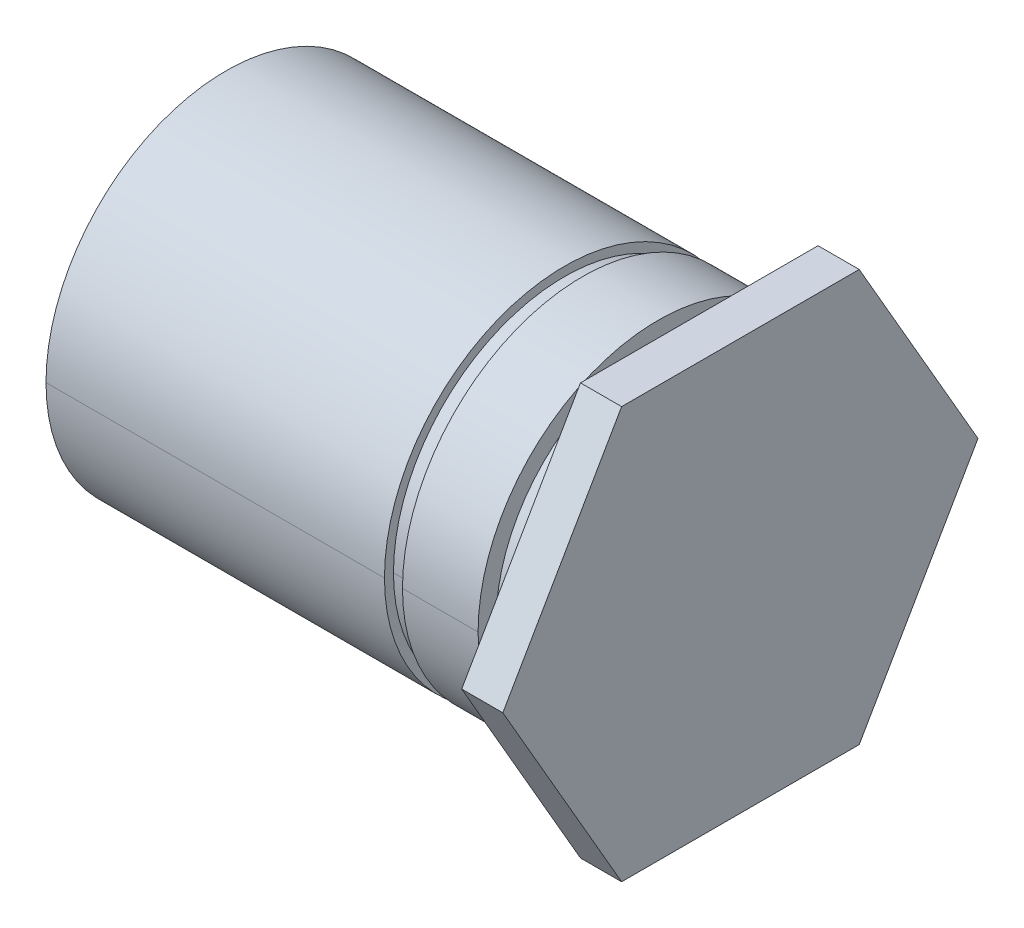
ISO-10303-21;
HEADER;
FILE_DESCRIPTION(('STEP AP214'),'2;1');
FILE_NAME('part.step','',(''),(''),'','','');
FILE_SCHEMA(('AUTOMOTIVE_DESIGN { 1 0 10303 214 1 1 1 1 }'));
ENDSEC;
DATA;
#1=APPLICATION_CONTEXT('core data for automotive mechanical design processes');
#2=APPLICATION_PROTOCOL_DEFINITION('international standard','automotive_design',2000,#1);
#3=PRODUCT_CONTEXT('',#1,'mechanical');
#4=PRODUCT('Part','Part','',(#3));
#5=PRODUCT_RELATED_PRODUCT_CATEGORY('part','',(#4));
#6=PRODUCT_DEFINITION_FORMATION('','',#4);
#7=PRODUCT_DEFINITION_CONTEXT('part definition',#1,'design');
#8=PRODUCT_DEFINITION('design','',#6,#7);
#9=PRODUCT_DEFINITION_SHAPE('','',#8);
#10=(LENGTH_UNIT() NAMED_UNIT(*) SI_UNIT(.MILLI.,.METRE.));
#11=(NAMED_UNIT(*) PLANE_ANGLE_UNIT() SI_UNIT($,.RADIAN.));
#12=(NAMED_UNIT(*) SI_UNIT($,.STERADIAN.) SOLID_ANGLE_UNIT());
#13=UNCERTAINTY_MEASURE_WITH_UNIT(LENGTH_MEASURE(1.E-05),#10,'distance_accuracy_value','');
#14=(GEOMETRIC_REPRESENTATION_CONTEXT(3) GLOBAL_UNCERTAINTY_ASSIGNED_CONTEXT((#13)) GLOBAL_UNIT_ASSIGNED_CONTEXT((#10,
#11,#12)) REPRESENTATION_CONTEXT('',''));
#15=CARTESIAN_POINT('',(0.,0.,0.));
#16=DIRECTION('',(0.,0.,1.));
#17=DIRECTION('',(1.,0.,0.));
#18=AXIS2_PLACEMENT_3D('',#15,#16,#17);
#19=CARTESIAN_POINT('',(-3.,0.,0.));
#20=DIRECTION('',(1.,0.,0.));
#21=DIRECTION('',(0.,0.,-1.));
#22=AXIS2_PLACEMENT_3D('',#19,#20,#21);
#23=CYLINDRICAL_SURFACE('',#22,2.1);
#24=CARTESIAN_POINT('',(-5.52,0.,0.));
#25=DIRECTION('',(1.,0.,0.));
#26=DIRECTION('',(0.,0.,-1.));
#27=AXIS2_PLACEMENT_3D('',#24,#25,#26);
#28=CIRCLE('',#27,2.1);
#29=CARTESIAN_POINT('',(-5.52,0.,-2.1));
#30=VERTEX_POINT('',#29);
#31=CARTESIAN_POINT('',(-5.52,0.,2.1));
#32=VERTEX_POINT('',#31);
#33=EDGE_CURVE('E11',#30,#32,#28,.T.);
#34=ORIENTED_EDGE('',*,*,#33,.T.);
#35=DIRECTION('',(1.,0.,0.));
#36=VECTOR('',#35,1.);
#37=CARTESIAN_POINT('',(-3.,0.,2.1));
#38=LINE('',#37,#36);
#39=CARTESIAN_POINT('',(-1.572,0.,2.1));
#40=VERTEX_POINT('',#39);
#41=EDGE_CURVE('E24',#32,#40,#38,.T.);
#42=ORIENTED_EDGE('',*,*,#41,.T.);
#43=CARTESIAN_POINT('',(-1.572,0.,0.));
#44=DIRECTION('',(-1.,0.,0.));
#45=DIRECTION('',(0.,0.,-1.));
#46=AXIS2_PLACEMENT_3D('',#43,#44,#45);
#47=CIRCLE('',#46,2.1);
#48=CARTESIAN_POINT('',(-1.572,0.,-2.1));
#49=VERTEX_POINT('',#48);
#50=EDGE_CURVE('E320',#40,#49,#47,.T.);
#51=ORIENTED_EDGE('',*,*,#50,.T.);
#52=DIRECTION('',(1.,0.,0.));
#53=VECTOR('',#52,1.);
#54=CARTESIAN_POINT('',(-3.,0.,-2.1));
#55=LINE('',#54,#53);
#56=EDGE_CURVE('E317',#30,#49,#55,.T.);
#57=ORIENTED_EDGE('',*,*,#56,.F.);
#58=EDGE_LOOP('',(#34,#42,#51,#57));
#59=FACE_BOUND('',#58,.T.);
#60=ADVANCED_FACE('F17',(#59),#23,.T.);
#61=CARTESIAN_POINT('',(-5.52000000004682,0.,0.));
#62=DIRECTION('',(-1.,0.,0.));
#63=DIRECTION('',(0.,0.,1.));
#64=AXIS2_PLACEMENT_3D('',#61,#62,#63);
#65=CONICAL_SURFACE('',#64,1.50000000002137,0.785398163397448);
#66=CARTESIAN_POINT('',(-5.24450000000343,0.,0.));
#67=DIRECTION('',(-1.,0.,0.));
#68=DIRECTION('',(0.,0.,-1.));
#69=AXIS2_PLACEMENT_3D('',#66,#67,#68);
#70=CIRCLE('',#69,1.22449999997798);
#71=CARTESIAN_POINT('',(-5.24450000000343,0.,-1.22449999997798));
#72=VERTEX_POINT('',#71);
#73=CARTESIAN_POINT('',(-5.24450000000343,0.,1.22449999997798));
#74=VERTEX_POINT('',#73);
#75=EDGE_CURVE('E314',#72,#74,#70,.T.);
#76=ORIENTED_EDGE('',*,*,#75,.F.);
#77=DIRECTION('',(-0.707106781186548,0.,-0.707106781186548));
#78=VECTOR('',#77,1.);
#79=CARTESIAN_POINT('',(-5.52000000004682,0.,-1.50000000002137));
#80=LINE('',#79,#78);
#81=CARTESIAN_POINT('',(-5.52000000004682,0.,-1.50000000002137));
#82=VERTEX_POINT('',#81);
#83=EDGE_CURVE('E311',#72,#82,#80,.T.);
#84=ORIENTED_EDGE('',*,*,#83,.T.);
#85=CARTESIAN_POINT('',(-5.52000000004682,0.,0.));
#86=DIRECTION('',(1.,0.,0.));
#87=DIRECTION('',(0.,0.,1.));
#88=AXIS2_PLACEMENT_3D('',#85,#86,#87);
#89=CIRCLE('',#88,1.50000000002137);
#90=CARTESIAN_POINT('',(-5.52000000004682,0.,1.50000000002137));
#91=VERTEX_POINT('',#90);
#92=EDGE_CURVE('E309',#91,#82,#89,.T.);
#93=ORIENTED_EDGE('',*,*,#92,.F.);
#94=DIRECTION('',(-0.707106781186548,0.,0.707106781186548));
#95=VECTOR('',#94,1.);
#96=CARTESIAN_POINT('',(-5.52000000004682,0.,1.50000000002137));
#97=LINE('',#96,#95);
#98=EDGE_CURVE('E307',#74,#91,#97,.T.);
#99=ORIENTED_EDGE('',*,*,#98,.F.);
#100=EDGE_LOOP('',(#76,#84,#93,#99));
#101=FACE_BOUND('',#100,.T.);
#102=ADVANCED_FACE('F335',(#101),#65,.F.);
#103=CARTESIAN_POINT('',(-1.467,0.,0.));
#104=DIRECTION('',(1.,0.,0.));
#105=DIRECTION('',(0.,0.,-1.));
#106=AXIS2_PLACEMENT_3D('',#103,#104,#105);
#107=CYLINDRICAL_SURFACE('',#106,1.995);
#108=CARTESIAN_POINT('',(-1.572,0.,0.));
#109=DIRECTION('',(1.,0.,0.));
#110=DIRECTION('',(0.,0.,-1.));
#111=AXIS2_PLACEMENT_3D('',#108,#109,#110);
#112=CIRCLE('',#111,1.995);
#113=CARTESIAN_POINT('',(-1.572,0.,-1.995));
#114=VERTEX_POINT('',#113);
#115=CARTESIAN_POINT('',(-1.572,0.,1.995));
#116=VERTEX_POINT('',#115);
#117=EDGE_CURVE('E305',#114,#116,#112,.T.);
#118=ORIENTED_EDGE('',*,*,#117,.T.);
#119=DIRECTION('',(1.,0.,0.));
#120=VECTOR('',#119,1.);
#121=CARTESIAN_POINT('',(-1.467,0.,1.995));
#122=LINE('',#121,#120);
#123=CARTESIAN_POINT('',(-1.362,0.,1.995));
#124=VERTEX_POINT('',#123);
#125=EDGE_CURVE('E303',#116,#124,#122,.T.);
#126=ORIENTED_EDGE('',*,*,#125,.T.);
#127=CARTESIAN_POINT('',(-1.362,0.,0.));
#128=DIRECTION('',(-1.,0.,0.));
#129=DIRECTION('',(0.,0.,-1.));
#130=AXIS2_PLACEMENT_3D('',#127,#128,#129);
#131=CIRCLE('',#130,1.995);
#132=CARTESIAN_POINT('',(-1.362,0.,-1.995));
#133=VERTEX_POINT('',#132);
#134=EDGE_CURVE('E301',#124,#133,#131,.T.);
#135=ORIENTED_EDGE('',*,*,#134,.T.);
#136=DIRECTION('',(1.,0.,0.));
#137=VECTOR('',#136,1.);
#138=CARTESIAN_POINT('',(-1.467,0.,-1.995));
#139=LINE('',#138,#137);
#140=EDGE_CURVE('E298',#114,#133,#139,.T.);
#141=ORIENTED_EDGE('',*,*,#140,.F.);
#142=EDGE_LOOP('',(#118,#126,#135,#141));
#143=FACE_BOUND('',#142,.T.);
#144=ADVANCED_FACE('F366',(#143),#107,.T.);
#145=CARTESIAN_POINT('',(-3.78225,0.,0.));
#146=DIRECTION('',(-1.,0.,0.));
#147=DIRECTION('',(0.,0.,1.));
#148=AXIS2_PLACEMENT_3D('',#145,#146,#147);
#149=CYLINDRICAL_SURFACE('',#148,1.2245);
#150=CARTESIAN_POINT('',(-2.32,0.,0.));
#151=DIRECTION('',(-1.,0.,0.));
#152=DIRECTION('',(0.,0.,1.));
#153=AXIS2_PLACEMENT_3D('',#150,#151,#152);
#154=CIRCLE('',#153,1.2245);
#155=CARTESIAN_POINT('',(-2.32,0.,-1.2245));
#156=VERTEX_POINT('',#155);
#157=CARTESIAN_POINT('',(-2.32,0.,1.2245));
#158=VERTEX_POINT('',#157);
#159=EDGE_CURVE('E295',#156,#158,#154,.T.);
#160=ORIENTED_EDGE('',*,*,#159,.F.);
#161=DIRECTION('',(-1.,0.,0.));
#162=VECTOR('',#161,1.);
#163=CARTESIAN_POINT('',(-3.78225,0.,-1.2245));
#164=LINE('',#163,#162);
#165=EDGE_CURVE('E292',#156,#72,#164,.T.);
#166=ORIENTED_EDGE('',*,*,#165,.T.);
#167=ORIENTED_EDGE('',*,*,#75,.T.);
#168=DIRECTION('',(-1.,0.,0.));
#169=VECTOR('',#168,1.);
#170=CARTESIAN_POINT('',(-3.78225,0.,1.2245));
#171=LINE('',#170,#169);
#172=EDGE_CURVE('E289',#158,#74,#171,.T.);
#173=ORIENTED_EDGE('',*,*,#172,.F.);
#174=EDGE_LOOP('',(#160,#166,#167,#173));
#175=FACE_BOUND('',#174,.T.);
#176=ADVANCED_FACE('F341',(#175),#149,.F.);
#177=CARTESIAN_POINT('',(-3.,0.,0.));
#178=DIRECTION('',(1.,0.,0.));
#179=DIRECTION('',(0.,0.,-1.));
#180=AXIS2_PLACEMENT_3D('',#177,#178,#179);
#181=CYLINDRICAL_SURFACE('',#180,2.1);
#182=CARTESIAN_POINT('',(-1.362,0.,0.));
#183=DIRECTION('',(1.,0.,0.));
#184=DIRECTION('',(0.,0.,-1.));
#185=AXIS2_PLACEMENT_3D('',#182,#183,#184);
#186=CIRCLE('',#185,2.1);
#187=CARTESIAN_POINT('',(-1.362,0.,-2.1));
#188=VERTEX_POINT('',#187);
#189=CARTESIAN_POINT('',(-1.362,0.,2.1));
#190=VERTEX_POINT('',#189);
#191=EDGE_CURVE('E287',#188,#190,#186,.T.);
#192=ORIENTED_EDGE('',*,*,#191,.T.);
#193=DIRECTION('',(1.,0.,0.));
#194=VECTOR('',#193,1.);
#195=CARTESIAN_POINT('',(-3.,0.,2.1));
#196=LINE('',#195,#194);
#197=CARTESIAN_POINT('',(-0.480000000000001,0.,2.1));
#198=VERTEX_POINT('',#197);
#199=EDGE_CURVE('E285',#190,#198,#196,.T.);
#200=ORIENTED_EDGE('',*,*,#199,.T.);
#201=CARTESIAN_POINT('',(-0.48,0.,0.));
#202=DIRECTION('',(-1.,0.,0.));
#203=DIRECTION('',(0.,0.,-1.));
#204=AXIS2_PLACEMENT_3D('',#201,#202,#203);
#205=CIRCLE('',#204,2.1);
#206=CARTESIAN_POINT('',(-0.48,0.,-2.1));
#207=VERTEX_POINT('',#206);
#208=EDGE_CURVE('E283',#198,#207,#205,.T.);
#209=ORIENTED_EDGE('',*,*,#208,.T.);
#210=DIRECTION('',(1.,0.,0.));
#211=VECTOR('',#210,1.);
#212=CARTESIAN_POINT('',(-3.,0.,-2.1));
#213=LINE('',#212,#211);
#214=EDGE_CURVE('E280',#188,#207,#213,.T.);
#215=ORIENTED_EDGE('',*,*,#214,.F.);
#216=EDGE_LOOP('',(#192,#200,#209,#215));
#217=FACE_BOUND('',#216,.T.);
#218=ADVANCED_FACE('F375',(#217),#181,.T.);
#219=CARTESIAN_POINT('',(-1.62,0.,0.));
#220=DIRECTION('',(-1.,0.,0.));
#221=DIRECTION('',(0.,0.,1.));
#222=AXIS2_PLACEMENT_3D('',#219,#220,#221);
#223=CYLINDRICAL_SURFACE('',#222,1.2295);
#224=CARTESIAN_POINT('',(-0.92,0.,0.));
#225=DIRECTION('',(-1.,0.,0.));
#226=DIRECTION('',(0.,0.,1.));
#227=AXIS2_PLACEMENT_3D('',#224,#225,#226);
#228=CIRCLE('',#227,1.2295);
#229=CARTESIAN_POINT('',(-0.92,0.,-1.2295));
#230=VERTEX_POINT('',#229);
#231=CARTESIAN_POINT('',(-0.92,-1.22949999995184,0.));
#232=VERTEX_POINT('',#231);
#233=EDGE_CURVE('E277',#230,#232,#228,.T.);
#234=ORIENTED_EDGE('',*,*,#233,.F.);
#235=DIRECTION('',(-1.,0.,0.));
#236=VECTOR('',#235,1.);
#237=CARTESIAN_POINT('',(-1.62,0.,-1.2295));
#238=LINE('',#237,#236);
#239=CARTESIAN_POINT('',(-2.32,0.,-1.2295));
#240=VERTEX_POINT('',#239);
#241=EDGE_CURVE('E274',#230,#240,#238,.T.);
#242=ORIENTED_EDGE('',*,*,#241,.T.);
#243=CARTESIAN_POINT('',(-2.32,0.,0.));
#244=DIRECTION('',(1.,0.,0.));
#245=DIRECTION('',(0.,0.,1.));
#246=AXIS2_PLACEMENT_3D('',#243,#244,#245);
#247=CIRCLE('',#246,1.2295);
#248=CARTESIAN_POINT('',(-2.32,0.,1.2295));
#249=VERTEX_POINT('',#248);
#250=EDGE_CURVE('E272',#249,#240,#247,.T.);
#251=ORIENTED_EDGE('',*,*,#250,.F.);
#252=DIRECTION('',(-1.,0.,0.));
#253=VECTOR('',#252,1.);
#254=CARTESIAN_POINT('',(-1.62,0.,1.2295));
#255=LINE('',#254,#253);
#256=CARTESIAN_POINT('',(-0.92,0.,1.2295));
#257=VERTEX_POINT('',#256);
#258=EDGE_CURVE('E270',#257,#249,#255,.T.);
#259=ORIENTED_EDGE('',*,*,#258,.F.);
#260=CARTESIAN_POINT('',(-0.92,0.,0.));
#261=DIRECTION('',(-1.,0.,0.));
#262=DIRECTION('',(0.,0.,1.));
#263=AXIS2_PLACEMENT_3D('',#260,#261,#262);
#264=CIRCLE('',#263,1.2295);
#265=EDGE_CURVE('E268',#232,#257,#264,.T.);
#266=ORIENTED_EDGE('',*,*,#265,.F.);
#267=EDGE_LOOP('',(#234,#242,#251,#259,#266));
#268=FACE_BOUND('',#267,.T.);
#269=ADVANCED_FACE('F378',(#268),#223,.F.);
#270=CARTESIAN_POINT('',(-0.920000000007804,0.,0.));
#271=DIRECTION('',(-1.,0.,0.));
#272=DIRECTION('',(0.,-1.,0.));
#273=AXIS2_PLACEMENT_3D('',#270,#271,#272);
#274=CONICAL_SURFACE('',#273,1.22949999996536,1.04719755115849);
#275=DIRECTION('',(-0.500000000033003,-0.866025403765385,0.));
#276=VECTOR('',#275,1.);
#277=CARTESIAN_POINT('',(-0.920000000007803,-1.22949999996536,0.));
#278=LINE('',#277,#276);
#279=CARTESIAN_POINT('',(-0.210147844057928,0.,-5.6843418860808E-11));
#280=VERTEX_POINT('',#279);
#281=EDGE_CURVE('E265',#280,#232,#278,.T.);
#282=ORIENTED_EDGE('',*,*,#281,.F.);
#283=DIRECTION('',(-0.500000000033003,0.866025403765385,0.));
#284=VECTOR('',#283,1.);
#285=CARTESIAN_POINT('',(-0.920000000007804,1.22949999996536,0.));
#286=LINE('',#285,#284);
#287=CARTESIAN_POINT('',(-0.92,1.22949999995184,0.));
#288=VERTEX_POINT('',#287);
#289=EDGE_CURVE('E262',#280,#288,#286,.T.);
#290=ORIENTED_EDGE('',*,*,#289,.T.);
#291=CARTESIAN_POINT('',(-0.92,0.,0.));
#292=DIRECTION('',(-1.,0.,0.));
#293=DIRECTION('',(0.,0.,1.));
#294=AXIS2_PLACEMENT_3D('',#291,#292,#293);
#295=CIRCLE('',#294,1.2295);
#296=EDGE_CURVE('E259',#288,#230,#295,.T.);
#297=ORIENTED_EDGE('',*,*,#296,.T.);
#298=ORIENTED_EDGE('',*,*,#233,.T.);
#299=EDGE_LOOP('',(#282,#290,#297,#298));
#300=FACE_BOUND('',#299,.T.);
#301=ADVANCED_FACE('F382',(#300),#274,.F.);
#302=CARTESIAN_POINT('',(-0.24,0.,0.));
#303=DIRECTION('',(1.,0.,0.));
#304=DIRECTION('',(0.,0.,-1.));
#305=AXIS2_PLACEMENT_3D('',#302,#303,#304);
#306=CYLINDRICAL_SURFACE('',#305,1.89);
#307=CARTESIAN_POINT('',(-0.48,0.,0.));
#308=DIRECTION('',(-1.,0.,0.));
#309=DIRECTION('',(0.,0.,-1.));
#310=AXIS2_PLACEMENT_3D('',#307,#308,#309);
#311=CIRCLE('',#310,1.89);
#312=CARTESIAN_POINT('',(-0.48,0.,1.89));
#313=VERTEX_POINT('',#312);
#314=CARTESIAN_POINT('',(-0.479999999999999,0.,-1.89));
#315=VERTEX_POINT('',#314);
#316=EDGE_CURVE('E257',#313,#315,#311,.T.);
#317=ORIENTED_EDGE('',*,*,#316,.F.);
#318=DIRECTION('',(1.,0.,0.));
#319=VECTOR('',#318,1.);
#320=CARTESIAN_POINT('',(-0.24,0.,1.89));
#321=LINE('',#320,#319);
#322=CARTESIAN_POINT('',(0.,0.,1.89));
#323=VERTEX_POINT('',#322);
#324=EDGE_CURVE('E255',#313,#323,#321,.T.);
#325=ORIENTED_EDGE('',*,*,#324,.T.);
#326=CARTESIAN_POINT('',(0.,0.,0.));
#327=DIRECTION('',(-1.,0.,0.));
#328=DIRECTION('',(0.,0.,-1.));
#329=AXIS2_PLACEMENT_3D('',#326,#327,#328);
#330=CIRCLE('',#329,1.89);
#331=CARTESIAN_POINT('',(0.,0.,-1.89));
#332=VERTEX_POINT('',#331);
#333=EDGE_CURVE('E253',#323,#332,#330,.T.);
#334=ORIENTED_EDGE('',*,*,#333,.T.);
#335=DIRECTION('',(1.,0.,0.));
#336=VECTOR('',#335,1.);
#337=CARTESIAN_POINT('',(-0.24,0.,-1.89));
#338=LINE('',#337,#336);
#339=EDGE_CURVE('E250',#315,#332,#338,.T.);
#340=ORIENTED_EDGE('',*,*,#339,.F.);
#341=EDGE_LOOP('',(#317,#325,#334,#340));
#342=FACE_BOUND('',#341,.T.);
#343=ADVANCED_FACE('F386',(#342),#306,.T.);
#344=CARTESIAN_POINT('',(-3.,0.,0.));
#345=DIRECTION('',(1.,0.,0.));
#346=DIRECTION('',(0.,0.,-1.));
#347=AXIS2_PLACEMENT_3D('',#344,#345,#346);
#348=CYLINDRICAL_SURFACE('',#347,2.1);
#349=ORIENTED_EDGE('',*,*,#41,.F.);
#350=CARTESIAN_POINT('',(-5.52,0.,0.));
#351=DIRECTION('',(1.,0.,0.));
#352=DIRECTION('',(0.,0.,-1.));
#353=AXIS2_PLACEMENT_3D('',#350,#351,#352);
#354=CIRCLE('',#353,2.1);
#355=EDGE_CURVE('E247',#32,#30,#354,.T.);
#356=ORIENTED_EDGE('',*,*,#355,.T.);
#357=ORIENTED_EDGE('',*,*,#56,.T.);
#358=CARTESIAN_POINT('',(-1.572,0.,0.));
#359=DIRECTION('',(-1.,0.,0.));
#360=DIRECTION('',(0.,0.,-1.));
#361=AXIS2_PLACEMENT_3D('',#358,#359,#360);
#362=CIRCLE('',#361,2.1);
#363=EDGE_CURVE('E244',#49,#40,#362,.T.);
#364=ORIENTED_EDGE('',*,*,#363,.T.);
#365=EDGE_LOOP('',(#349,#356,#357,#364));
#366=FACE_BOUND('',#365,.T.);
#367=ADVANCED_FACE('F326',(#366),#348,.T.);
#368=CARTESIAN_POINT('',(-5.52,0.,1.05));
#369=DIRECTION('',(-1.,0.,0.));
#370=DIRECTION('',(0.,0.,1.));
#371=AXIS2_PLACEMENT_3D('',#368,#369,#370);
#372=PLANE('',#371);
#373=ORIENTED_EDGE('',*,*,#33,.F.);
#374=ORIENTED_EDGE('',*,*,#355,.F.);
#375=EDGE_LOOP('',(#373,#374));
#376=FACE_BOUND('',#375,.T.);
#377=ORIENTED_EDGE('',*,*,#92,.T.);
#378=CARTESIAN_POINT('',(-5.52000000004682,0.,0.));
#379=DIRECTION('',(1.,0.,0.));
#380=DIRECTION('',(0.,0.,1.));
#381=AXIS2_PLACEMENT_3D('',#378,#379,#380);
#382=CIRCLE('',#381,1.50000000002137);
#383=EDGE_CURVE('E241',#82,#91,#382,.T.);
#384=ORIENTED_EDGE('',*,*,#383,.T.);
#385=EDGE_LOOP('',(#377,#384));
#386=FACE_BOUND('',#385,.T.);
#387=ADVANCED_FACE('F327',(#376,#386),#372,.T.);
#388=CARTESIAN_POINT('',(-1.572,0.,2.0475));
#389=DIRECTION('',(-1.,0.,0.));
#390=DIRECTION('',(0.,0.,1.));
#391=AXIS2_PLACEMENT_3D('',#388,#389,#390);
#392=PLANE('',#391);
#393=ORIENTED_EDGE('',*,*,#117,.F.);
#394=CARTESIAN_POINT('',(-1.572,0.,0.));
#395=DIRECTION('',(1.,0.,0.));
#396=DIRECTION('',(0.,0.,-1.));
#397=AXIS2_PLACEMENT_3D('',#394,#395,#396);
#398=CIRCLE('',#397,1.995);
#399=EDGE_CURVE('E238',#116,#114,#398,.T.);
#400=ORIENTED_EDGE('',*,*,#399,.F.);
#401=EDGE_LOOP('',(#393,#400));
#402=FACE_BOUND('',#401,.T.);
#403=ORIENTED_EDGE('',*,*,#363,.F.);
#404=ORIENTED_EDGE('',*,*,#50,.F.);
#405=EDGE_LOOP('',(#403,#404));
#406=FACE_BOUND('',#405,.T.);
#407=ADVANCED_FACE('F325',(#402,#406),#392,.F.);
#408=CARTESIAN_POINT('',(-5.52000000004682,0.,0.));
#409=DIRECTION('',(-1.,0.,0.));
#410=DIRECTION('',(0.,0.,1.));
#411=AXIS2_PLACEMENT_3D('',#408,#409,#410);
#412=CONICAL_SURFACE('',#411,1.50000000002137,0.785398163397448);
#413=ORIENTED_EDGE('',*,*,#83,.F.);
#414=CARTESIAN_POINT('',(-5.24450000000343,0.,0.));
#415=DIRECTION('',(-1.,0.,0.));
#416=DIRECTION('',(0.,0.,-1.));
#417=AXIS2_PLACEMENT_3D('',#414,#415,#416);
#418=CIRCLE('',#417,1.22449999997798);
#419=EDGE_CURVE('E235',#74,#72,#418,.T.);
#420=ORIENTED_EDGE('',*,*,#419,.F.);
#421=ORIENTED_EDGE('',*,*,#98,.T.);
#422=ORIENTED_EDGE('',*,*,#383,.F.);
#423=EDGE_LOOP('',(#413,#420,#421,#422));
#424=FACE_BOUND('',#423,.T.);
#425=ADVANCED_FACE('F338',(#424),#412,.F.);
#426=CARTESIAN_POINT('',(-1.467,0.,0.));
#427=DIRECTION('',(1.,0.,0.));
#428=DIRECTION('',(0.,0.,-1.));
#429=AXIS2_PLACEMENT_3D('',#426,#427,#428);
#430=CYLINDRICAL_SURFACE('',#429,1.995);
#431=ORIENTED_EDGE('',*,*,#125,.F.);
#432=ORIENTED_EDGE('',*,*,#399,.T.);
#433=ORIENTED_EDGE('',*,*,#140,.T.);
#434=CARTESIAN_POINT('',(-1.362,0.,0.));
#435=DIRECTION('',(-1.,0.,0.));
#436=DIRECTION('',(0.,0.,-1.));
#437=AXIS2_PLACEMENT_3D('',#434,#435,#436);
#438=CIRCLE('',#437,1.995);
#439=EDGE_CURVE('E232',#133,#124,#438,.T.);
#440=ORIENTED_EDGE('',*,*,#439,.T.);
#441=EDGE_LOOP('',(#431,#432,#433,#440));
#442=FACE_BOUND('',#441,.T.);
#443=ADVANCED_FACE('F398',(#442),#430,.T.);
#444=CARTESIAN_POINT('',(-3.78225,0.,0.));
#445=DIRECTION('',(-1.,0.,0.));
#446=DIRECTION('',(0.,0.,1.));
#447=AXIS2_PLACEMENT_3D('',#444,#445,#446);
#448=CYLINDRICAL_SURFACE('',#447,1.2245);
#449=ORIENTED_EDGE('',*,*,#165,.F.);
#450=CARTESIAN_POINT('',(-2.32,0.,0.));
#451=DIRECTION('',(-1.,0.,0.));
#452=DIRECTION('',(0.,0.,1.));
#453=AXIS2_PLACEMENT_3D('',#450,#451,#452);
#454=CIRCLE('',#453,1.2245);
#455=EDGE_CURVE('E229',#158,#156,#454,.T.);
#456=ORIENTED_EDGE('',*,*,#455,.F.);
#457=ORIENTED_EDGE('',*,*,#172,.T.);
#458=ORIENTED_EDGE('',*,*,#419,.T.);
#459=EDGE_LOOP('',(#449,#456,#457,#458));
#460=FACE_BOUND('',#459,.T.);
#461=ADVANCED_FACE('F344',(#460),#448,.F.);
#462=CARTESIAN_POINT('',(-1.362,0.,2.0475));
#463=DIRECTION('',(1.,0.,0.));
#464=DIRECTION('',(0.,0.,-1.));
#465=AXIS2_PLACEMENT_3D('',#462,#463,#464);
#466=PLANE('',#465);
#467=ORIENTED_EDGE('',*,*,#191,.F.);
#468=CARTESIAN_POINT('',(-1.362,0.,0.));
#469=DIRECTION('',(1.,0.,0.));
#470=DIRECTION('',(0.,0.,-1.));
#471=AXIS2_PLACEMENT_3D('',#468,#469,#470);
#472=CIRCLE('',#471,2.1);
#473=EDGE_CURVE('E226',#190,#188,#472,.T.);
#474=ORIENTED_EDGE('',*,*,#473,.F.);
#475=EDGE_LOOP('',(#467,#474));
#476=FACE_BOUND('',#475,.T.);
#477=ORIENTED_EDGE('',*,*,#439,.F.);
#478=ORIENTED_EDGE('',*,*,#134,.F.);
#479=EDGE_LOOP('',(#477,#478));
#480=FACE_BOUND('',#479,.T.);
#481=ADVANCED_FACE('F349',(#476,#480),#466,.F.);
#482=CARTESIAN_POINT('',(-2.32,0.,-1.36225));
#483=DIRECTION('',(1.,0.,0.));
#484=DIRECTION('',(0.,0.,-1.));
#485=AXIS2_PLACEMENT_3D('',#482,#483,#484);
#486=PLANE('',#485);
#487=ORIENTED_EDGE('',*,*,#250,.T.);
#488=CARTESIAN_POINT('',(-2.32,0.,0.));
#489=DIRECTION('',(1.,0.,0.));
#490=DIRECTION('',(0.,0.,1.));
#491=AXIS2_PLACEMENT_3D('',#488,#489,#490);
#492=CIRCLE('',#491,1.2295);
#493=EDGE_CURVE('E223',#240,#249,#492,.T.);
#494=ORIENTED_EDGE('',*,*,#493,.T.);
#495=EDGE_LOOP('',(#487,#494));
#496=FACE_BOUND('',#495,.T.);
#497=ORIENTED_EDGE('',*,*,#455,.T.);
#498=ORIENTED_EDGE('',*,*,#159,.T.);
#499=EDGE_LOOP('',(#497,#498));
#500=FACE_BOUND('',#499,.T.);
#501=ADVANCED_FACE('F346',(#496,#500),#486,.T.);
#502=CARTESIAN_POINT('',(-3.,0.,0.));
#503=DIRECTION('',(1.,0.,0.));
#504=DIRECTION('',(0.,0.,-1.));
#505=AXIS2_PLACEMENT_3D('',#502,#503,#504);
#506=CYLINDRICAL_SURFACE('',#505,2.1);
#507=ORIENTED_EDGE('',*,*,#199,.F.);
#508=ORIENTED_EDGE('',*,*,#473,.T.);
#509=ORIENTED_EDGE('',*,*,#214,.T.);
#510=CARTESIAN_POINT('',(-0.48,0.,0.));
#511=DIRECTION('',(-1.,0.,0.));
#512=DIRECTION('',(0.,0.,-1.));
#513=AXIS2_PLACEMENT_3D('',#510,#511,#512);
#514=CIRCLE('',#513,2.1);
#515=EDGE_CURVE('E220',#207,#198,#514,.T.);
#516=ORIENTED_EDGE('',*,*,#515,.T.);
#517=EDGE_LOOP('',(#507,#508,#509,#516));
#518=FACE_BOUND('',#517,.T.);
#519=ADVANCED_FACE('F348',(#518),#506,.T.);
#520=CARTESIAN_POINT('',(-1.62,0.,0.));
#521=DIRECTION('',(-1.,0.,0.));
#522=DIRECTION('',(0.,0.,1.));
#523=AXIS2_PLACEMENT_3D('',#520,#521,#522);
#524=CYLINDRICAL_SURFACE('',#523,1.2295);
#525=ORIENTED_EDGE('',*,*,#241,.F.);
#526=ORIENTED_EDGE('',*,*,#296,.F.);
#527=CARTESIAN_POINT('',(-0.92,0.,0.));
#528=DIRECTION('',(-1.,0.,0.));
#529=DIRECTION('',(0.,0.,1.));
#530=AXIS2_PLACEMENT_3D('',#527,#528,#529);
#531=CIRCLE('',#530,1.2295);
#532=EDGE_CURVE('E217',#257,#288,#531,.T.);
#533=ORIENTED_EDGE('',*,*,#532,.F.);
#534=ORIENTED_EDGE('',*,*,#258,.T.);
#535=ORIENTED_EDGE('',*,*,#493,.F.);
#536=EDGE_LOOP('',(#525,#526,#533,#534,#535));
#537=FACE_BOUND('',#536,.T.);
#538=ADVANCED_FACE('F357',(#537),#524,.F.);
#539=CARTESIAN_POINT('',(-0.48,0.,1.05));
#540=DIRECTION('',(1.,0.,0.));
#541=DIRECTION('',(0.,0.,-1.));
#542=AXIS2_PLACEMENT_3D('',#539,#540,#541);
#543=PLANE('',#542);
#544=ORIENTED_EDGE('',*,*,#515,.F.);
#545=ORIENTED_EDGE('',*,*,#208,.F.);
#546=EDGE_LOOP('',(#544,#545));
#547=FACE_BOUND('',#546,.T.);
#548=CARTESIAN_POINT('',(-0.48,0.,0.));
#549=DIRECTION('',(-1.,0.,0.));
#550=DIRECTION('',(0.,0.,-1.));
#551=AXIS2_PLACEMENT_3D('',#548,#549,#550);
#552=CIRCLE('',#551,1.89);
#553=EDGE_CURVE('E214',#315,#313,#552,.T.);
#554=ORIENTED_EDGE('',*,*,#553,.T.);
#555=ORIENTED_EDGE('',*,*,#316,.T.);
#556=EDGE_LOOP('',(#554,#555));
#557=FACE_BOUND('',#556,.T.);
#558=ADVANCED_FACE('F438',(#547,#557),#543,.T.);
#559=CARTESIAN_POINT('',(-0.920000000007804,0.,0.));
#560=DIRECTION('',(-1.,0.,0.));
#561=DIRECTION('',(0.,-1.,0.));
#562=AXIS2_PLACEMENT_3D('',#559,#560,#561);
#563=CONICAL_SURFACE('',#562,1.22949999996536,1.04719755115849);
#564=ORIENTED_EDGE('',*,*,#289,.F.);
#565=ORIENTED_EDGE('',*,*,#281,.T.);
#566=ORIENTED_EDGE('',*,*,#265,.T.);
#567=ORIENTED_EDGE('',*,*,#532,.T.);
#568=EDGE_LOOP('',(#564,#565,#566,#567));
#569=FACE_BOUND('',#568,.T.);
#570=ADVANCED_FACE('F448',(#569),#563,.F.);
#571=CARTESIAN_POINT('',(-0.24,0.,0.));
#572=DIRECTION('',(1.,0.,0.));
#573=DIRECTION('',(0.,0.,-1.));
#574=AXIS2_PLACEMENT_3D('',#571,#572,#573);
#575=CYLINDRICAL_SURFACE('',#574,1.89);
#576=ORIENTED_EDGE('',*,*,#324,.F.);
#577=ORIENTED_EDGE('',*,*,#553,.F.);
#578=ORIENTED_EDGE('',*,*,#339,.T.);
#579=CARTESIAN_POINT('',(0.,0.,0.));
#580=DIRECTION('',(-1.,0.,0.));
#581=DIRECTION('',(0.,0.,-1.));
#582=AXIS2_PLACEMENT_3D('',#579,#580,#581);
#583=CIRCLE('',#582,1.89);
#584=EDGE_CURVE('E211',#332,#323,#583,.T.);
#585=ORIENTED_EDGE('',*,*,#584,.T.);
#586=EDGE_LOOP('',(#576,#577,#578,#585));
#587=FACE_BOUND('',#586,.T.);
#588=ADVANCED_FACE('F458',(#587),#575,.T.);
#589=CARTESIAN_POINT('',(0.,0.,0.));
#590=DIRECTION('',(1.,0.,0.));
#591=DIRECTION('',(0.,1.,0.));
#592=AXIS2_PLACEMENT_3D('',#589,#590,#591);
#593=PLANE('',#592);
#594=ORIENTED_EDGE('',*,*,#584,.F.);
#595=ORIENTED_EDGE('',*,*,#333,.F.);
#596=EDGE_LOOP('',(#594,#595));
#597=FACE_BOUND('',#596,.T.);
#598=DIRECTION('',(0.,0.,1.));
#599=VECTOR('',#598,1.);
#600=CARTESIAN_POINT('',(0.,2.4,0.));
#601=LINE('',#600,#599);
#602=CARTESIAN_POINT('',(0.,2.4,-1.3856406460551));
#603=VERTEX_POINT('',#602);
#604=CARTESIAN_POINT('',(0.,2.4,1.3856406460551));
#605=VERTEX_POINT('',#604);
#606=EDGE_CURVE('E208',#603,#605,#601,.T.);
#607=ORIENTED_EDGE('',*,*,#606,.F.);
#608=DIRECTION('',(0.,0.866025403784439,0.499999999999999));
#609=VECTOR('',#608,1.);
#610=CARTESIAN_POINT('',(0.,0.,-2.7712812921102));
#611=LINE('',#610,#609);
#612=CARTESIAN_POINT('',(0.,0.,-2.7712812921102));
#613=VERTEX_POINT('',#612);
#614=EDGE_CURVE('E205',#613,#603,#611,.T.);
#615=ORIENTED_EDGE('',*,*,#614,.F.);
#616=DIRECTION('',(0.,0.866025403784439,-0.5));
#617=VECTOR('',#616,1.);
#618=CARTESIAN_POINT('',(0.,-2.4,-1.3856406460551));
#619=LINE('',#618,#617);
#620=CARTESIAN_POINT('',(0.,-2.4,-1.3856406460551));
#621=VERTEX_POINT('',#620);
#622=EDGE_CURVE('E203',#621,#613,#619,.T.);
#623=ORIENTED_EDGE('',*,*,#622,.F.);
#624=DIRECTION('',(0.,0.,-1.));
#625=VECTOR('',#624,1.);
#626=CARTESIAN_POINT('',(0.,-2.4,0.));
#627=LINE('',#626,#625);
#628=CARTESIAN_POINT('',(0.,-2.4,1.3856406460551));
#629=VERTEX_POINT('',#628);
#630=EDGE_CURVE('E201',#629,#621,#627,.T.);
#631=ORIENTED_EDGE('',*,*,#630,.F.);
#632=DIRECTION('',(0.,-0.866025403784439,-0.5));
#633=VECTOR('',#632,1.);
#634=CARTESIAN_POINT('',(0.,0.,2.7712812921102));
#635=LINE('',#634,#633);
#636=CARTESIAN_POINT('',(0.,0.,2.7712812921102));
#637=VERTEX_POINT('',#636);
#638=EDGE_CURVE('E170',#637,#629,#635,.T.);
#639=ORIENTED_EDGE('',*,*,#638,.F.);
#640=DIRECTION('',(0.,-0.866025403784439,0.5));
#641=VECTOR('',#640,1.);
#642=CARTESIAN_POINT('',(0.,2.4,1.3856406460551));
#643=LINE('',#642,#641);
#644=EDGE_CURVE('E197',#605,#637,#643,.T.);
#645=ORIENTED_EDGE('',*,*,#644,.F.);
#646=EDGE_LOOP('',(#607,#615,#623,#631,#639,#645));
#647=FACE_BOUND('',#646,.T.);
#648=ADVANCED_FACE('F467',(#597,#647),#593,.F.);
#649=CARTESIAN_POINT('',(0.,0.,2.7712812921102));
#650=DIRECTION('',(0.,0.5,0.866025403784439));
#651=DIRECTION('',(0.,-0.866025403784439,0.5));
#652=AXIS2_PLACEMENT_3D('',#649,#650,#651);
#653=PLANE('',#652);
#654=ORIENTED_EDGE('',*,*,#644,.T.);
#655=DIRECTION('',(1.,0.,0.));
#656=VECTOR('',#655,1.);
#657=CARTESIAN_POINT('',(0.,0.,2.7712812921102));
#658=LINE('',#657,#656);
#659=CARTESIAN_POINT('',(0.48,0.,2.7712812921102));
#660=VERTEX_POINT('',#659);
#661=EDGE_CURVE('E195',#637,#660,#658,.T.);
#662=ORIENTED_EDGE('',*,*,#661,.T.);
#663=DIRECTION('',(0.,0.866025403784439,-0.5));
#664=VECTOR('',#663,1.);
#665=CARTESIAN_POINT('',(0.48,0.,2.7712812921102));
#666=LINE('',#665,#664);
#667=CARTESIAN_POINT('',(0.48,2.4,1.3856406460551));
#668=VERTEX_POINT('',#667);
#669=EDGE_CURVE('E175',#660,#668,#666,.T.);
#670=ORIENTED_EDGE('',*,*,#669,.T.);
#671=DIRECTION('',(-1.,0.,0.));
#672=VECTOR('',#671,1.);
#673=CARTESIAN_POINT('',(0.,2.4,1.3856406460551));
#674=LINE('',#673,#672);
#675=EDGE_CURVE('E191',#668,#605,#674,.T.);
#676=ORIENTED_EDGE('',*,*,#675,.T.);
#677=EDGE_LOOP('',(#654,#662,#670,#676));
#678=FACE_BOUND('',#677,.T.);
#679=ADVANCED_FACE('F477',(#678),#653,.T.);
#680=CARTESIAN_POINT('',(0.,2.4,1.3856406460551));
#681=DIRECTION('',(0.,1.,0.));
#682=DIRECTION('',(0.,0.,1.));
#683=AXIS2_PLACEMENT_3D('',#680,#681,#682);
#684=PLANE('',#683);
#685=ORIENTED_EDGE('',*,*,#606,.T.);
#686=ORIENTED_EDGE('',*,*,#675,.F.);
#687=DIRECTION('',(0.,0.,-1.));
#688=VECTOR('',#687,1.);
#689=CARTESIAN_POINT('',(0.48,2.4,1.3856406460551));
#690=LINE('',#689,#688);
#691=CARTESIAN_POINT('',(0.48,2.4,-1.3856406460551));
#692=VERTEX_POINT('',#691);
#693=EDGE_CURVE('E189',#668,#692,#690,.T.);
#694=ORIENTED_EDGE('',*,*,#693,.T.);
#695=DIRECTION('',(-1.,0.,0.));
#696=VECTOR('',#695,1.);
#697=CARTESIAN_POINT('',(0.,2.4,-1.3856406460551));
#698=LINE('',#697,#696);
#699=EDGE_CURVE('E186',#692,#603,#698,.T.);
#700=ORIENTED_EDGE('',*,*,#699,.T.);
#701=EDGE_LOOP('',(#685,#686,#694,#700));
#702=FACE_BOUND('',#701,.T.);
#703=ADVANCED_FACE('F487',(#702),#684,.T.);
#704=CARTESIAN_POINT('',(0.,2.4,-1.3856406460551));
#705=DIRECTION('',(0.,0.5,-0.866025403784439));
#706=DIRECTION('',(0.,0.866025403784439,0.5));
#707=AXIS2_PLACEMENT_3D('',#704,#705,#706);
#708=PLANE('',#707);
#709=ORIENTED_EDGE('',*,*,#614,.T.);
#710=ORIENTED_EDGE('',*,*,#699,.F.);
#711=DIRECTION('',(0.,-0.866025403784439,-0.5));
#712=VECTOR('',#711,1.);
#713=CARTESIAN_POINT('',(0.48,2.4,-1.3856406460551));
#714=LINE('',#713,#712);
#715=CARTESIAN_POINT('',(0.48,0.,-2.7712812921102));
#716=VERTEX_POINT('',#715);
#717=EDGE_CURVE('E184',#692,#716,#714,.T.);
#718=ORIENTED_EDGE('',*,*,#717,.T.);
#719=DIRECTION('',(-1.,0.,0.));
#720=VECTOR('',#719,1.);
#721=CARTESIAN_POINT('',(0.,0.,-2.7712812921102));
#722=LINE('',#721,#720);
#723=EDGE_CURVE('E181',#716,#613,#722,.T.);
#724=ORIENTED_EDGE('',*,*,#723,.T.);
#725=EDGE_LOOP('',(#709,#710,#718,#724));
#726=FACE_BOUND('',#725,.T.);
#727=ADVANCED_FACE('F497',(#726),#708,.T.);
#728=CARTESIAN_POINT('',(0.,0.,-2.7712812921102));
#729=DIRECTION('',(0.,-0.5,-0.866025403784438));
#730=DIRECTION('',(0.,0.866025403784438,-0.5));
#731=AXIS2_PLACEMENT_3D('',#728,#729,#730);
#732=PLANE('',#731);
#733=ORIENTED_EDGE('',*,*,#622,.T.);
#734=ORIENTED_EDGE('',*,*,#723,.F.);
#735=DIRECTION('',(0.,-0.866025403784438,0.5));
#736=VECTOR('',#735,1.);
#737=CARTESIAN_POINT('',(0.48,0.,-2.7712812921102));
#738=LINE('',#737,#736);
#739=CARTESIAN_POINT('',(0.48,-2.4,-1.3856406460551));
#740=VERTEX_POINT('',#739);
#741=EDGE_CURVE('E179',#716,#740,#738,.T.);
#742=ORIENTED_EDGE('',*,*,#741,.T.);
#743=DIRECTION('',(-1.,0.,0.));
#744=VECTOR('',#743,1.);
#745=CARTESIAN_POINT('',(0.,-2.4,-1.3856406460551));
#746=LINE('',#745,#744);
#747=EDGE_CURVE('E158',#740,#621,#746,.T.);
#748=ORIENTED_EDGE('',*,*,#747,.T.);
#749=EDGE_LOOP('',(#733,#734,#742,#748));
#750=FACE_BOUND('',#749,.T.);
#751=ADVANCED_FACE('F507',(#750),#732,.T.);
#752=CARTESIAN_POINT('',(0.,-2.4,-1.3856406460551));
#753=DIRECTION('',(0.,-1.,0.));
#754=DIRECTION('',(0.,0.,-1.));
#755=AXIS2_PLACEMENT_3D('',#752,#753,#754);
#756=PLANE('',#755);
#757=ORIENTED_EDGE('',*,*,#630,.T.);
#758=ORIENTED_EDGE('',*,*,#747,.F.);
#759=DIRECTION('',(0.,0.,1.));
#760=VECTOR('',#759,1.);
#761=CARTESIAN_POINT('',(0.48,-2.4,-1.3856406460551));
#762=LINE('',#761,#760);
#763=CARTESIAN_POINT('',(0.48,-2.4,1.3856406460551));
#764=VERTEX_POINT('',#763);
#765=EDGE_CURVE('E152',#740,#764,#762,.T.);
#766=ORIENTED_EDGE('',*,*,#765,.T.);
#767=DIRECTION('',(-1.,0.,0.));
#768=VECTOR('',#767,1.);
#769=CARTESIAN_POINT('',(0.,-2.4,1.3856406460551));
#770=LINE('',#769,#768);
#771=EDGE_CURVE('E156',#764,#629,#770,.T.);
#772=ORIENTED_EDGE('',*,*,#771,.T.);
#773=EDGE_LOOP('',(#757,#758,#766,#772));
#774=FACE_BOUND('',#773,.T.);
#775=ADVANCED_FACE('F155',(#774),#756,.T.);
#776=CARTESIAN_POINT('',(0.,-2.4,1.3856406460551));
#777=DIRECTION('',(0.,-0.5,0.866025403784439));
#778=DIRECTION('',(0.,-0.866025403784439,-0.5));
#779=AXIS2_PLACEMENT_3D('',#776,#777,#778);
#780=PLANE('',#779);
#781=ORIENTED_EDGE('',*,*,#638,.T.);
#782=ORIENTED_EDGE('',*,*,#771,.F.);
#783=DIRECTION('',(0.,0.866025403784439,0.5));
#784=VECTOR('',#783,1.);
#785=CARTESIAN_POINT('',(0.48,-2.4,1.3856406460551));
#786=LINE('',#785,#784);
#787=EDGE_CURVE('E169',#764,#660,#786,.T.);
#788=ORIENTED_EDGE('',*,*,#787,.T.);
#789=ORIENTED_EDGE('',*,*,#661,.F.);
#790=EDGE_LOOP('',(#781,#782,#788,#789));
#791=FACE_BOUND('',#790,.T.);
#792=ADVANCED_FACE('F167',(#791),#780,.T.);
#793=CARTESIAN_POINT('',(0.48,0.,0.));
#794=DIRECTION('',(1.,0.,0.));
#795=DIRECTION('',(0.,1.,0.));
#796=AXIS2_PLACEMENT_3D('',#793,#794,#795);
#797=PLANE('',#796);
#798=ORIENTED_EDGE('',*,*,#741,.F.);
#799=ORIENTED_EDGE('',*,*,#717,.F.);
#800=ORIENTED_EDGE('',*,*,#693,.F.);
#801=ORIENTED_EDGE('',*,*,#669,.F.);
#802=ORIENTED_EDGE('',*,*,#787,.F.);
#803=ORIENTED_EDGE('',*,*,#765,.F.);
#804=EDGE_LOOP('',(#798,#799,#800,#801,#802,#803));
#805=FACE_BOUND('',#804,.T.);
#806=ADVANCED_FACE('F173',(#805),#797,.T.);
#807=CLOSED_SHELL('',(#60,#102,#144,#176,#218,#269,#301,#343,#367,#387,#407,#425,#443,#461,#481,
#501,#519,#538,#558,#570,#588,#648,#679,#703,#727,#751,#775,#792,#806));
#808=MANIFOLD_SOLID_BREP('B1',#807);
#809=ADVANCED_BREP_SHAPE_REPRESENTATION('',(#18,#808),#14);
#810=SHAPE_DEFINITION_REPRESENTATION(#9,#809);
ENDSEC;
END-ISO-10303-21;
